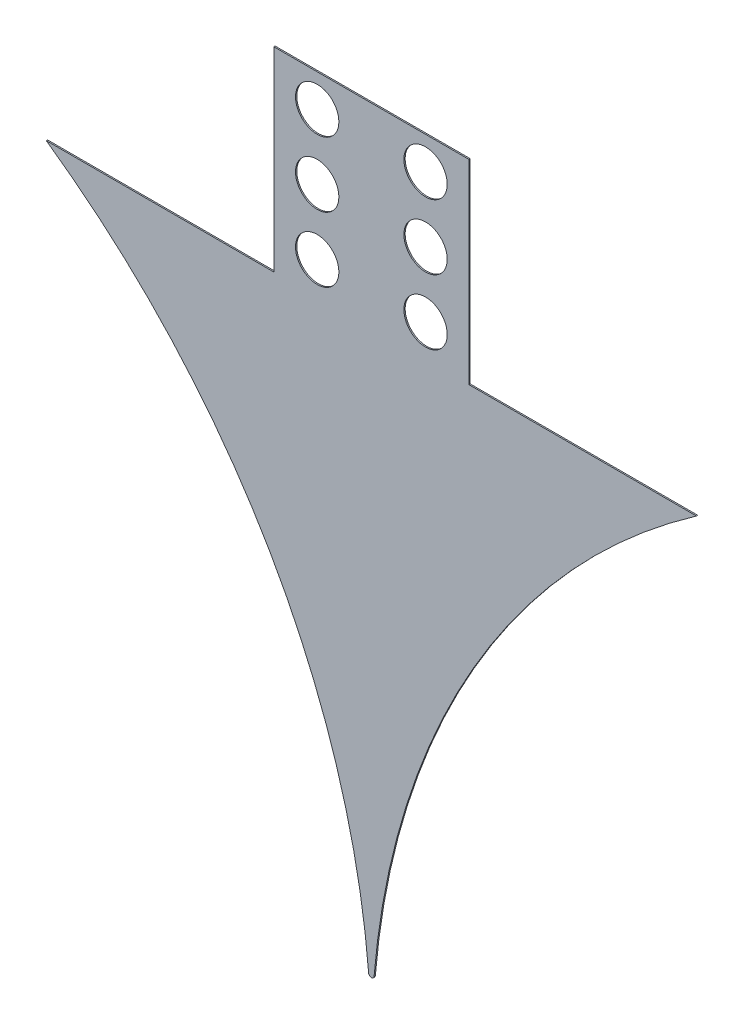
ISO-10303-21;
HEADER;
FILE_DESCRIPTION(('STEP AP214'),'2;1');
FILE_NAME('part.step','',(''),(''),'','','');
FILE_SCHEMA(('AUTOMOTIVE_DESIGN { 1 0 10303 214 1 1 1 1 }'));
ENDSEC;
DATA;
#1=APPLICATION_CONTEXT('core data for automotive mechanical design processes');
#2=APPLICATION_PROTOCOL_DEFINITION('international standard','automotive_design',2000,#1);
#3=PRODUCT_CONTEXT('',#1,'mechanical');
#4=PRODUCT('Part','Part','',(#3));
#5=PRODUCT_RELATED_PRODUCT_CATEGORY('part','',(#4));
#6=PRODUCT_DEFINITION_FORMATION('','',#4);
#7=PRODUCT_DEFINITION_CONTEXT('part definition',#1,'design');
#8=PRODUCT_DEFINITION('design','',#6,#7);
#9=PRODUCT_DEFINITION_SHAPE('','',#8);
#10=(LENGTH_UNIT() NAMED_UNIT(*) SI_UNIT(.MILLI.,.METRE.));
#11=(NAMED_UNIT(*) PLANE_ANGLE_UNIT() SI_UNIT($,.RADIAN.));
#12=(NAMED_UNIT(*) SI_UNIT($,.STERADIAN.) SOLID_ANGLE_UNIT());
#13=UNCERTAINTY_MEASURE_WITH_UNIT(LENGTH_MEASURE(1.E-05),#10,'distance_accuracy_value','');
#14=(GEOMETRIC_REPRESENTATION_CONTEXT(3) GLOBAL_UNCERTAINTY_ASSIGNED_CONTEXT((#13)) GLOBAL_UNIT_ASSIGNED_CONTEXT((#10,
#11,#12)) REPRESENTATION_CONTEXT('',''));
#15=CARTESIAN_POINT('',(0.,0.,0.));
#16=DIRECTION('',(0.,0.,1.));
#17=DIRECTION('',(1.,0.,0.));
#18=AXIS2_PLACEMENT_3D('',#15,#16,#17);
#19=CARTESIAN_POINT('',(225.968773271415,-92.4309538826946,0.118));
#20=DIRECTION('',(0.,-1.,0.));
#21=DIRECTION('',(0.,0.,-1.));
#22=AXIS2_PLACEMENT_3D('',#19,#20,#21);
#23=PLANE('',#22);
#24=DIRECTION('',(0.,0.,-1.));
#25=VECTOR('',#24,1.);
#26=CARTESIAN_POINT('',(8.99999999999999,-92.4309538826946,25.5738441227157));
#27=LINE('',#26,#25);
#28=CARTESIAN_POINT('',(8.99999999999999,-92.4309538826946,0.118));
#29=VERTEX_POINT('',#28);
#30=CARTESIAN_POINT('',(8.99999999999999,-92.4309538826946,0.));
#31=VERTEX_POINT('',#30);
#32=EDGE_CURVE('E110',#29,#31,#27,.T.);
#33=ORIENTED_EDGE('',*,*,#32,.F.);
#34=DIRECTION('',(-1.,0.,0.));
#35=VECTOR('',#34,1.);
#36=CARTESIAN_POINT('',(225.968773271415,-92.4309538826946,0.118));
#37=LINE('',#36,#35);
#38=CARTESIAN_POINT('',(30.,-92.4309538826946,0.118));
#39=VERTEX_POINT('',#38);
#40=EDGE_CURVE('E107',#39,#29,#37,.T.);
#41=ORIENTED_EDGE('',*,*,#40,.F.);
#42=DIRECTION('',(0.,0.,-1.));
#43=VECTOR('',#42,1.);
#44=CARTESIAN_POINT('',(30.,-92.4309538826946,0.118));
#45=LINE('',#44,#43);
#46=CARTESIAN_POINT('',(30.,-92.4309538826946,0.));
#47=VERTEX_POINT('',#46);
#48=EDGE_CURVE('E152',#47,#39,#45,.F.);
#49=ORIENTED_EDGE('',*,*,#48,.F.);
#50=DIRECTION('',(-1.,0.,0.));
#51=VECTOR('',#50,1.);
#52=CARTESIAN_POINT('',(225.968773271415,-92.4309538826946,0.));
#53=LINE('',#52,#51);
#54=EDGE_CURVE('E140',#47,#31,#53,.T.);
#55=ORIENTED_EDGE('',*,*,#54,.T.);
#56=EDGE_LOOP('',(#33,#41,#49,#55));
#57=FACE_BOUND('',#56,.T.);
#58=ADVANCED_FACE('F35',(#57),#23,.F.);
#59=CARTESIAN_POINT('',(27.0477038578761,55.0264810983675,0.118));
#60=DIRECTION('',(0.,0.,1.));
#61=DIRECTION('',(1.,0.,0.));
#62=AXIS2_PLACEMENT_3D('',#59,#60,#61);
#63=PLANE('',#62);
#64=CARTESIAN_POINT('',(-70.2365845142739,-150.,0.118));
#65=DIRECTION('',(0.,0.,-1.));
#66=DIRECTION('',(-1.,0.,0.));
#67=AXIS2_PLACEMENT_3D('',#64,#65,#66);
#68=CIRCLE('',#67,70.2365845142739);
#69=CARTESIAN_POINT('',(-30.,-92.4309538826946,0.118));
#70=VERTEX_POINT('',#69);
#71=CARTESIAN_POINT('',(-0.249113306447876,-144.089697286563,0.118));
#72=VERTEX_POINT('',#71);
#73=EDGE_CURVE('E147',#70,#72,#68,.T.);
#74=ORIENTED_EDGE('',*,*,#73,.T.);
#75=CARTESIAN_POINT('',(0.,-144.068660163409,0.118));
#76=DIRECTION('',(0.,0.,1.));
#77=DIRECTION('',(1.,0.,0.));
#78=AXIS2_PLACEMENT_3D('',#75,#76,#77);
#79=CIRCLE('',#78,0.25);
#80=CARTESIAN_POINT('',(0.249113306447876,-144.089697286563,0.118));
#81=VERTEX_POINT('',#80);
#82=EDGE_CURVE('E11',#72,#81,#79,.T.);
#83=ORIENTED_EDGE('',*,*,#82,.T.);
#84=CARTESIAN_POINT('',(70.2365845142739,-150.,0.118));
#85=DIRECTION('',(0.,0.,-1.));
#86=DIRECTION('',(1.,0.,0.));
#87=AXIS2_PLACEMENT_3D('',#84,#85,#86);
#88=CIRCLE('',#87,70.2365845142739);
#89=EDGE_CURVE('E149',#81,#39,#88,.T.);
#90=ORIENTED_EDGE('',*,*,#89,.T.);
#91=ORIENTED_EDGE('',*,*,#40,.T.);
#92=DIRECTION('',(0.,-1.,0.));
#93=VECTOR('',#92,1.);
#94=CARTESIAN_POINT('',(9.,-74.4309538826946,0.118));
#95=LINE('',#94,#93);
#96=CARTESIAN_POINT('',(9.,-74.4309538826946,0.118));
#97=VERTEX_POINT('',#96);
#98=EDGE_CURVE('E99',#97,#29,#95,.T.);
#99=ORIENTED_EDGE('',*,*,#98,.F.);
#100=DIRECTION('',(1.,0.,0.));
#101=VECTOR('',#100,1.);
#102=CARTESIAN_POINT('',(9.,-74.4309538826946,0.118));
#103=LINE('',#102,#101);
#104=CARTESIAN_POINT('',(-9.,-74.4309538826946,0.118));
#105=VERTEX_POINT('',#104);
#106=EDGE_CURVE('E104',#105,#97,#103,.T.);
#107=ORIENTED_EDGE('',*,*,#106,.F.);
#108=DIRECTION('',(0.,1.,0.));
#109=VECTOR('',#108,1.);
#110=CARTESIAN_POINT('',(-9.,-74.4309538826946,0.118));
#111=LINE('',#110,#109);
#112=CARTESIAN_POINT('',(-9.,-92.4309538826946,0.118));
#113=VERTEX_POINT('',#112);
#114=EDGE_CURVE('E132',#113,#105,#111,.T.);
#115=ORIENTED_EDGE('',*,*,#114,.F.);
#116=EDGE_CURVE('E139',#113,#70,#37,.T.);
#117=ORIENTED_EDGE('',*,*,#116,.T.);
#118=EDGE_LOOP('',(#74,#83,#90,#91,#99,#107,#115,#117));
#119=FACE_BOUND('',#118,.T.);
#120=CARTESIAN_POINT('',(-5.,-89.4309538826946,0.118));
#121=DIRECTION('',(0.,0.,1.));
#122=DIRECTION('',(1.,0.,0.));
#123=AXIS2_PLACEMENT_3D('',#120,#121,#122);
#124=CIRCLE('',#123,2.);
#125=CARTESIAN_POINT('',(-3.,-89.4309538826946,0.118));
#126=VERTEX_POINT('',#125);
#127=EDGE_CURVE('E130',#126,#126,#124,.F.);
#128=ORIENTED_EDGE('',*,*,#127,.T.);
#129=EDGE_LOOP('',(#128));
#130=FACE_BOUND('',#129,.T.);
#131=CARTESIAN_POINT('',(-4.99999999999998,-83.4309538826946,0.118));
#132=DIRECTION('',(0.,0.,1.));
#133=DIRECTION('',(1.,0.,0.));
#134=AXIS2_PLACEMENT_3D('',#131,#132,#133);
#135=CIRCLE('',#134,2.);
#136=CARTESIAN_POINT('',(-2.99999999999998,-83.4309538826946,0.118));
#137=VERTEX_POINT('',#136);
#138=EDGE_CURVE('E229',#137,#137,#135,.F.);
#139=ORIENTED_EDGE('',*,*,#138,.T.);
#140=EDGE_LOOP('',(#139));
#141=FACE_BOUND('',#140,.T.);
#142=CARTESIAN_POINT('',(-4.99999999999996,-77.4309538826946,0.118));
#143=DIRECTION('',(0.,0.,1.));
#144=DIRECTION('',(1.,0.,0.));
#145=AXIS2_PLACEMENT_3D('',#142,#143,#144);
#146=CIRCLE('',#145,2.);
#147=CARTESIAN_POINT('',(-2.99999999999996,-77.4309538826946,0.118));
#148=VERTEX_POINT('',#147);
#149=EDGE_CURVE('E227',#148,#148,#146,.F.);
#150=ORIENTED_EDGE('',*,*,#149,.T.);
#151=EDGE_LOOP('',(#150));
#152=FACE_BOUND('',#151,.T.);
#153=CARTESIAN_POINT('',(5.00000000000004,-77.4309538826946,0.118));
#154=DIRECTION('',(0.,0.,1.));
#155=DIRECTION('',(1.,0.,0.));
#156=AXIS2_PLACEMENT_3D('',#153,#154,#155);
#157=CIRCLE('',#156,2.);
#158=CARTESIAN_POINT('',(7.00000000000004,-77.4309538826946,0.118));
#159=VERTEX_POINT('',#158);
#160=EDGE_CURVE('E224',#159,#159,#157,.F.);
#161=ORIENTED_EDGE('',*,*,#160,.T.);
#162=EDGE_LOOP('',(#161));
#163=FACE_BOUND('',#162,.T.);
#164=CARTESIAN_POINT('',(5.00000000000002,-83.4309538826946,0.118));
#165=DIRECTION('',(0.,0.,1.));
#166=DIRECTION('',(1.,0.,0.));
#167=AXIS2_PLACEMENT_3D('',#164,#165,#166);
#168=CIRCLE('',#167,2.);
#169=CARTESIAN_POINT('',(7.00000000000002,-83.4309538826946,0.118));
#170=VERTEX_POINT('',#169);
#171=EDGE_CURVE('E221',#170,#170,#168,.F.);
#172=ORIENTED_EDGE('',*,*,#171,.T.);
#173=EDGE_LOOP('',(#172));
#174=FACE_BOUND('',#173,.T.);
#175=CARTESIAN_POINT('',(5.,-89.4309538826946,0.118));
#176=DIRECTION('',(0.,0.,1.));
#177=DIRECTION('',(1.,0.,0.));
#178=AXIS2_PLACEMENT_3D('',#175,#176,#177);
#179=CIRCLE('',#178,2.);
#180=CARTESIAN_POINT('',(7.,-89.4309538826946,0.118));
#181=VERTEX_POINT('',#180);
#182=EDGE_CURVE('E218',#181,#181,#179,.F.);
#183=ORIENTED_EDGE('',*,*,#182,.T.);
#184=EDGE_LOOP('',(#183));
#185=FACE_BOUND('',#184,.T.);
#186=ADVANCED_FACE('F101',(#119,#130,#141,#152,#163,#174,#185),#63,.T.);
#187=CARTESIAN_POINT('',(27.0477038578761,55.0264810983675,0.));
#188=DIRECTION('',(0.,0.,1.));
#189=DIRECTION('',(1.,0.,0.));
#190=AXIS2_PLACEMENT_3D('',#187,#188,#189);
#191=PLANE('',#190);
#192=CARTESIAN_POINT('',(70.2365845142739,-150.,0.));
#193=DIRECTION('',(0.,0.,-1.));
#194=DIRECTION('',(1.,0.,0.));
#195=AXIS2_PLACEMENT_3D('',#192,#193,#194);
#196=CIRCLE('',#195,70.2365845142739);
#197=CARTESIAN_POINT('',(0.249113306447876,-144.089697286563,0.));
#198=VERTEX_POINT('',#197);
#199=EDGE_CURVE('E150',#198,#47,#196,.T.);
#200=ORIENTED_EDGE('',*,*,#199,.F.);
#201=CARTESIAN_POINT('',(0.,-144.068660163409,0.));
#202=DIRECTION('',(0.,0.,1.));
#203=DIRECTION('',(1.,0.,0.));
#204=AXIS2_PLACEMENT_3D('',#201,#202,#203);
#205=CIRCLE('',#204,0.25);
#206=CARTESIAN_POINT('',(-0.249113306447876,-144.089697286563,0.));
#207=VERTEX_POINT('',#206);
#208=EDGE_CURVE('E57',#198,#207,#205,.F.);
#209=ORIENTED_EDGE('',*,*,#208,.T.);
#210=CARTESIAN_POINT('',(-70.2365845142739,-150.,0.));
#211=DIRECTION('',(0.,0.,-1.));
#212=DIRECTION('',(-1.,0.,0.));
#213=AXIS2_PLACEMENT_3D('',#210,#211,#212);
#214=CIRCLE('',#213,70.2365845142739);
#215=CARTESIAN_POINT('',(-30.,-92.4309538826946,0.));
#216=VERTEX_POINT('',#215);
#217=EDGE_CURVE('E146',#216,#207,#214,.T.);
#218=ORIENTED_EDGE('',*,*,#217,.F.);
#219=CARTESIAN_POINT('',(-9.00000000000001,-92.4309538826946,0.));
#220=VERTEX_POINT('',#219);
#221=EDGE_CURVE('E143',#220,#216,#53,.T.);
#222=ORIENTED_EDGE('',*,*,#221,.F.);
#223=DIRECTION('',(0.,1.,0.));
#224=VECTOR('',#223,1.);
#225=CARTESIAN_POINT('',(-9.,-74.4309538826946,0.));
#226=LINE('',#225,#224);
#227=CARTESIAN_POINT('',(-9.,-74.4309538826946,0.));
#228=VERTEX_POINT('',#227);
#229=EDGE_CURVE('E195',#220,#228,#226,.T.);
#230=ORIENTED_EDGE('',*,*,#229,.T.);
#231=DIRECTION('',(1.,0.,0.));
#232=VECTOR('',#231,1.);
#233=CARTESIAN_POINT('',(9.,-74.4309538826946,0.));
#234=LINE('',#233,#232);
#235=CARTESIAN_POINT('',(9.,-74.4309538826946,0.));
#236=VERTEX_POINT('',#235);
#237=EDGE_CURVE('E196',#228,#236,#234,.T.);
#238=ORIENTED_EDGE('',*,*,#237,.T.);
#239=DIRECTION('',(0.,-1.,0.));
#240=VECTOR('',#239,1.);
#241=CARTESIAN_POINT('',(9.,-74.4309538826946,0.));
#242=LINE('',#241,#240);
#243=EDGE_CURVE('E117',#236,#31,#242,.T.);
#244=ORIENTED_EDGE('',*,*,#243,.T.);
#245=ORIENTED_EDGE('',*,*,#54,.F.);
#246=EDGE_LOOP('',(#200,#209,#218,#222,#230,#238,#244,#245));
#247=FACE_BOUND('',#246,.T.);
#248=CARTESIAN_POINT('',(-4.99999999999996,-77.4309538826946,0.));
#249=DIRECTION('',(0.,0.,-1.));
#250=DIRECTION('',(-1.,0.,0.));
#251=AXIS2_PLACEMENT_3D('',#248,#249,#250);
#252=CIRCLE('',#251,2.);
#253=CARTESIAN_POINT('',(-6.99999999999996,-77.4309538826946,0.));
#254=VERTEX_POINT('',#253);
#255=EDGE_CURVE('E197',#254,#254,#252,.T.);
#256=ORIENTED_EDGE('',*,*,#255,.F.);
#257=EDGE_LOOP('',(#256));
#258=FACE_BOUND('',#257,.T.);
#259=CARTESIAN_POINT('',(5.00000000000004,-77.4309538826946,0.));
#260=DIRECTION('',(0.,0.,-1.));
#261=DIRECTION('',(-1.,0.,0.));
#262=AXIS2_PLACEMENT_3D('',#259,#260,#261);
#263=CIRCLE('',#262,2.);
#264=CARTESIAN_POINT('',(3.00000000000004,-77.4309538826946,0.));
#265=VERTEX_POINT('',#264);
#266=EDGE_CURVE('E201',#265,#265,#263,.T.);
#267=ORIENTED_EDGE('',*,*,#266,.F.);
#268=EDGE_LOOP('',(#267));
#269=FACE_BOUND('',#268,.T.);
#270=CARTESIAN_POINT('',(-4.99999999999998,-83.4309538826946,0.));
#271=DIRECTION('',(0.,0.,-1.));
#272=DIRECTION('',(-1.,0.,0.));
#273=AXIS2_PLACEMENT_3D('',#270,#271,#272);
#274=CIRCLE('',#273,2.);
#275=CARTESIAN_POINT('',(-6.99999999999998,-83.4309538826946,0.));
#276=VERTEX_POINT('',#275);
#277=EDGE_CURVE('E213',#276,#276,#274,.T.);
#278=ORIENTED_EDGE('',*,*,#277,.F.);
#279=EDGE_LOOP('',(#278));
#280=FACE_BOUND('',#279,.T.);
#281=CARTESIAN_POINT('',(5.00000000000002,-83.4309538826946,0.));
#282=DIRECTION('',(0.,0.,-1.));
#283=DIRECTION('',(-1.,0.,0.));
#284=AXIS2_PLACEMENT_3D('',#281,#282,#283);
#285=CIRCLE('',#284,2.);
#286=CARTESIAN_POINT('',(3.00000000000002,-83.4309538826946,0.));
#287=VERTEX_POINT('',#286);
#288=EDGE_CURVE('E210',#287,#287,#285,.T.);
#289=ORIENTED_EDGE('',*,*,#288,.F.);
#290=EDGE_LOOP('',(#289));
#291=FACE_BOUND('',#290,.T.);
#292=CARTESIAN_POINT('',(-5.,-89.4309538826946,0.));
#293=DIRECTION('',(0.,0.,-1.));
#294=DIRECTION('',(-1.,0.,0.));
#295=AXIS2_PLACEMENT_3D('',#292,#293,#294);
#296=CIRCLE('',#295,2.);
#297=CARTESIAN_POINT('',(-7.,-89.4309538826946,0.));
#298=VERTEX_POINT('',#297);
#299=EDGE_CURVE('E207',#298,#298,#296,.T.);
#300=ORIENTED_EDGE('',*,*,#299,.F.);
#301=EDGE_LOOP('',(#300));
#302=FACE_BOUND('',#301,.T.);
#303=CARTESIAN_POINT('',(5.,-89.4309538826946,0.));
#304=DIRECTION('',(0.,0.,-1.));
#305=DIRECTION('',(-1.,0.,0.));
#306=AXIS2_PLACEMENT_3D('',#303,#304,#305);
#307=CIRCLE('',#306,2.);
#308=CARTESIAN_POINT('',(3.,-89.4309538826946,0.));
#309=VERTEX_POINT('',#308);
#310=EDGE_CURVE('E121',#309,#309,#307,.T.);
#311=ORIENTED_EDGE('',*,*,#310,.F.);
#312=EDGE_LOOP('',(#311));
#313=FACE_BOUND('',#312,.T.);
#314=ADVANCED_FACE('F168',(#247,#258,#269,#280,#291,#302,#313),#191,.F.);
#315=CARTESIAN_POINT('',(-70.2365845142739,-150.,0.118));
#316=DIRECTION('',(0.,0.,-1.));
#317=DIRECTION('',(-1.,0.,0.));
#318=AXIS2_PLACEMENT_3D('',#315,#316,#317);
#319=CYLINDRICAL_SURFACE('',#318,70.2365845142739);
#320=ORIENTED_EDGE('',*,*,#217,.T.);
#321=DIRECTION('',(0.,0.,-1.));
#322=VECTOR('',#321,1.);
#323=CARTESIAN_POINT('',(-0.249113306447876,-144.089697286563,0.118));
#324=LINE('',#323,#322);
#325=EDGE_CURVE('E43',#207,#72,#324,.F.);
#326=ORIENTED_EDGE('',*,*,#325,.T.);
#327=ORIENTED_EDGE('',*,*,#73,.F.);
#328=DIRECTION('',(0.,0.,-1.));
#329=VECTOR('',#328,1.);
#330=CARTESIAN_POINT('',(-30.,-92.4309538826946,0.118));
#331=LINE('',#330,#329);
#332=EDGE_CURVE('E138',#70,#216,#331,.T.);
#333=ORIENTED_EDGE('',*,*,#332,.T.);
#334=EDGE_LOOP('',(#320,#326,#327,#333));
#335=FACE_BOUND('',#334,.T.);
#336=ADVANCED_FACE('F188',(#335),#319,.F.);
#337=CARTESIAN_POINT('',(70.2365845142739,-150.,0.118));
#338=DIRECTION('',(0.,0.,-1.));
#339=DIRECTION('',(-1.,0.,0.));
#340=AXIS2_PLACEMENT_3D('',#337,#338,#339);
#341=CYLINDRICAL_SURFACE('',#340,70.2365845142739);
#342=ORIENTED_EDGE('',*,*,#89,.F.);
#343=DIRECTION('',(0.,0.,-1.));
#344=VECTOR('',#343,1.);
#345=CARTESIAN_POINT('',(0.249113306447876,-144.089697286563,0.118));
#346=LINE('',#345,#344);
#347=EDGE_CURVE('E157',#81,#198,#346,.T.);
#348=ORIENTED_EDGE('',*,*,#347,.T.);
#349=ORIENTED_EDGE('',*,*,#199,.T.);
#350=ORIENTED_EDGE('',*,*,#48,.T.);
#351=EDGE_LOOP('',(#342,#348,#349,#350));
#352=FACE_BOUND('',#351,.T.);
#353=ADVANCED_FACE('F163',(#352),#341,.F.);
#354=ORIENTED_EDGE('',*,*,#116,.F.);
#355=DIRECTION('',(0.,0.,-1.));
#356=VECTOR('',#355,1.);
#357=CARTESIAN_POINT('',(-9.00000000000001,-92.4309538826946,25.5738441227157));
#358=LINE('',#357,#356);
#359=EDGE_CURVE('E111',#113,#220,#358,.T.);
#360=ORIENTED_EDGE('',*,*,#359,.T.);
#361=ORIENTED_EDGE('',*,*,#221,.T.);
#362=ORIENTED_EDGE('',*,*,#332,.F.);
#363=EDGE_LOOP('',(#354,#360,#361,#362));
#364=FACE_BOUND('',#363,.T.);
#365=ADVANCED_FACE('F173',(#364),#23,.F.);
#366=CARTESIAN_POINT('',(-9.,-74.4309538826946,25.5738441227157));
#367=DIRECTION('',(-1.,0.,0.));
#368=DIRECTION('',(0.,-1.,0.));
#369=AXIS2_PLACEMENT_3D('',#366,#367,#368);
#370=PLANE('',#369);
#371=ORIENTED_EDGE('',*,*,#359,.F.);
#372=ORIENTED_EDGE('',*,*,#114,.T.);
#373=DIRECTION('',(0.,0.,-1.));
#374=VECTOR('',#373,1.);
#375=CARTESIAN_POINT('',(-9.,-74.4309538826946,25.5738441227157));
#376=LINE('',#375,#374);
#377=EDGE_CURVE('E125',#105,#228,#376,.T.);
#378=ORIENTED_EDGE('',*,*,#377,.T.);
#379=ORIENTED_EDGE('',*,*,#229,.F.);
#380=EDGE_LOOP('',(#371,#372,#378,#379));
#381=FACE_BOUND('',#380,.T.);
#382=ADVANCED_FACE('F180',(#381),#370,.T.);
#383=CARTESIAN_POINT('',(9.,-74.4309538826946,25.5738441227157));
#384=DIRECTION('',(1.,0.,0.));
#385=DIRECTION('',(0.,1.,0.));
#386=AXIS2_PLACEMENT_3D('',#383,#384,#385);
#387=PLANE('',#386);
#388=DIRECTION('',(0.,0.,-1.));
#389=VECTOR('',#388,1.);
#390=CARTESIAN_POINT('',(9.,-74.4309538826946,25.5738441227157));
#391=LINE('',#390,#389);
#392=EDGE_CURVE('E114',#97,#236,#391,.T.);
#393=ORIENTED_EDGE('',*,*,#392,.F.);
#394=ORIENTED_EDGE('',*,*,#98,.T.);
#395=ORIENTED_EDGE('',*,*,#32,.T.);
#396=ORIENTED_EDGE('',*,*,#243,.F.);
#397=EDGE_LOOP('',(#393,#394,#395,#396));
#398=FACE_BOUND('',#397,.T.);
#399=ADVANCED_FACE('F115',(#398),#387,.T.);
#400=CARTESIAN_POINT('',(9.,-74.4309538826946,25.5738441227157));
#401=DIRECTION('',(0.,1.,0.));
#402=DIRECTION('',(0.,0.,1.));
#403=AXIS2_PLACEMENT_3D('',#400,#401,#402);
#404=PLANE('',#403);
#405=ORIENTED_EDGE('',*,*,#377,.F.);
#406=ORIENTED_EDGE('',*,*,#106,.T.);
#407=ORIENTED_EDGE('',*,*,#392,.T.);
#408=ORIENTED_EDGE('',*,*,#237,.F.);
#409=EDGE_LOOP('',(#405,#406,#407,#408));
#410=FACE_BOUND('',#409,.T.);
#411=ADVANCED_FACE('F124',(#410),#404,.T.);
#412=CARTESIAN_POINT('',(5.,-89.4309538826946,25.5738441227157));
#413=DIRECTION('',(0.,0.,-1.));
#414=DIRECTION('',(-1.,0.,0.));
#415=AXIS2_PLACEMENT_3D('',#412,#413,#414);
#416=CYLINDRICAL_SURFACE('',#415,2.);
#417=ORIENTED_EDGE('',*,*,#310,.T.);
#418=EDGE_LOOP('',(#417));
#419=FACE_BOUND('',#418,.T.);
#420=ORIENTED_EDGE('',*,*,#182,.F.);
#421=EDGE_LOOP('',(#420));
#422=FACE_BOUND('',#421,.T.);
#423=ADVANCED_FACE('F239',(#419,#422),#416,.F.);
#424=CARTESIAN_POINT('',(-5.,-89.4309538826946,25.5738441227157));
#425=DIRECTION('',(0.,0.,-1.));
#426=DIRECTION('',(-1.,0.,0.));
#427=AXIS2_PLACEMENT_3D('',#424,#425,#426);
#428=CYLINDRICAL_SURFACE('',#427,2.);
#429=ORIENTED_EDGE('',*,*,#299,.T.);
#430=EDGE_LOOP('',(#429));
#431=FACE_BOUND('',#430,.T.);
#432=ORIENTED_EDGE('',*,*,#127,.F.);
#433=EDGE_LOOP('',(#432));
#434=FACE_BOUND('',#433,.T.);
#435=ADVANCED_FACE('F236',(#431,#434),#428,.F.);
#436=CARTESIAN_POINT('',(5.00000000000002,-83.4309538826946,25.5738441227157));
#437=DIRECTION('',(0.,0.,-1.));
#438=DIRECTION('',(-1.,0.,0.));
#439=AXIS2_PLACEMENT_3D('',#436,#437,#438);
#440=CYLINDRICAL_SURFACE('',#439,2.);
#441=ORIENTED_EDGE('',*,*,#288,.T.);
#442=EDGE_LOOP('',(#441));
#443=FACE_BOUND('',#442,.T.);
#444=ORIENTED_EDGE('',*,*,#171,.F.);
#445=EDGE_LOOP('',(#444));
#446=FACE_BOUND('',#445,.T.);
#447=ADVANCED_FACE('F238',(#443,#446),#440,.F.);
#448=CARTESIAN_POINT('',(-4.99999999999998,-83.4309538826946,25.5738441227157));
#449=DIRECTION('',(0.,0.,-1.));
#450=DIRECTION('',(-1.,0.,0.));
#451=AXIS2_PLACEMENT_3D('',#448,#449,#450);
#452=CYLINDRICAL_SURFACE('',#451,2.);
#453=ORIENTED_EDGE('',*,*,#277,.T.);
#454=EDGE_LOOP('',(#453));
#455=FACE_BOUND('',#454,.T.);
#456=ORIENTED_EDGE('',*,*,#138,.F.);
#457=EDGE_LOOP('',(#456));
#458=FACE_BOUND('',#457,.T.);
#459=ADVANCED_FACE('F246',(#455,#458),#452,.F.);
#460=CARTESIAN_POINT('',(5.00000000000004,-77.4309538826946,25.5738441227157));
#461=DIRECTION('',(0.,0.,-1.));
#462=DIRECTION('',(-1.,0.,0.));
#463=AXIS2_PLACEMENT_3D('',#460,#461,#462);
#464=CYLINDRICAL_SURFACE('',#463,2.);
#465=ORIENTED_EDGE('',*,*,#266,.T.);
#466=EDGE_LOOP('',(#465));
#467=FACE_BOUND('',#466,.T.);
#468=ORIENTED_EDGE('',*,*,#160,.F.);
#469=EDGE_LOOP('',(#468));
#470=FACE_BOUND('',#469,.T.);
#471=ADVANCED_FACE('F254',(#467,#470),#464,.F.);
#472=CARTESIAN_POINT('',(-4.99999999999996,-77.4309538826946,25.5738441227157));
#473=DIRECTION('',(0.,0.,-1.));
#474=DIRECTION('',(-1.,0.,0.));
#475=AXIS2_PLACEMENT_3D('',#472,#473,#474);
#476=CYLINDRICAL_SURFACE('',#475,2.);
#477=ORIENTED_EDGE('',*,*,#255,.T.);
#478=EDGE_LOOP('',(#477));
#479=FACE_BOUND('',#478,.T.);
#480=ORIENTED_EDGE('',*,*,#149,.F.);
#481=EDGE_LOOP('',(#480));
#482=FACE_BOUND('',#481,.T.);
#483=ADVANCED_FACE('F257',(#479,#482),#476,.F.);
#484=CARTESIAN_POINT('',(0.,-144.068660163409,0.118));
#485=DIRECTION('',(0.,0.,-1.));
#486=DIRECTION('',(-1.,0.,0.));
#487=AXIS2_PLACEMENT_3D('',#484,#485,#486);
#488=CYLINDRICAL_SURFACE('',#487,0.25);
#489=ORIENTED_EDGE('',*,*,#82,.F.);
#490=ORIENTED_EDGE('',*,*,#325,.F.);
#491=ORIENTED_EDGE('',*,*,#208,.F.);
#492=ORIENTED_EDGE('',*,*,#347,.F.);
#493=EDGE_LOOP('',(#489,#490,#491,#492));
#494=FACE_BOUND('',#493,.T.);
#495=ADVANCED_FACE('F37',(#494),#488,.T.);
#496=CLOSED_SHELL('',(#58,#186,#314,#336,#353,#365,#382,#399,#411,#423,#435,#447,#459,#471,#483,#495));
#497=MANIFOLD_SOLID_BREP('B2',#496);
#498=ADVANCED_BREP_SHAPE_REPRESENTATION('',(#18,#497),#14);
#499=SHAPE_DEFINITION_REPRESENTATION(#9,#498);
ENDSEC;
END-ISO-10303-21;
